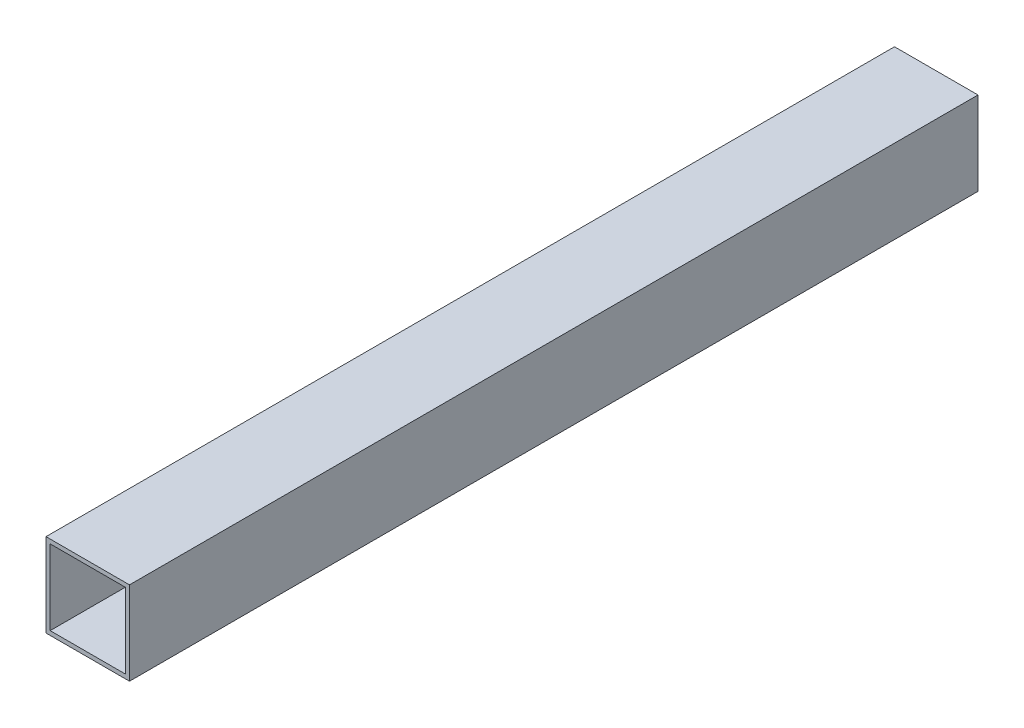
ISO-10303-21;
HEADER;
FILE_DESCRIPTION(('STEP AP214'),'2;1');
FILE_NAME('part.step','',(''),(''),'','','');
FILE_SCHEMA(('AUTOMOTIVE_DESIGN { 1 0 10303 214 1 1 1 1 }'));
ENDSEC;
DATA;
#1=APPLICATION_CONTEXT('core data for automotive mechanical design processes');
#2=APPLICATION_PROTOCOL_DEFINITION('international standard','automotive_design',2000,#1);
#3=PRODUCT_CONTEXT('',#1,'mechanical');
#4=PRODUCT('Part','Part','',(#3));
#5=PRODUCT_RELATED_PRODUCT_CATEGORY('part','',(#4));
#6=PRODUCT_DEFINITION_FORMATION('','',#4);
#7=PRODUCT_DEFINITION_CONTEXT('part definition',#1,'design');
#8=PRODUCT_DEFINITION('design','',#6,#7);
#9=PRODUCT_DEFINITION_SHAPE('','',#8);
#10=(LENGTH_UNIT() NAMED_UNIT(*) SI_UNIT(.MILLI.,.METRE.));
#11=(NAMED_UNIT(*) PLANE_ANGLE_UNIT() SI_UNIT($,.RADIAN.));
#12=(NAMED_UNIT(*) SI_UNIT($,.STERADIAN.) SOLID_ANGLE_UNIT());
#13=UNCERTAINTY_MEASURE_WITH_UNIT(LENGTH_MEASURE(1.E-05),#10,'distance_accuracy_value','');
#14=(GEOMETRIC_REPRESENTATION_CONTEXT(3) GLOBAL_UNCERTAINTY_ASSIGNED_CONTEXT((#13)) GLOBAL_UNIT_ASSIGNED_CONTEXT((#10,
#11,#12)) REPRESENTATION_CONTEXT('',''));
#15=CARTESIAN_POINT('',(0.,0.,0.));
#16=DIRECTION('',(0.,0.,1.));
#17=DIRECTION('',(1.,0.,0.));
#18=AXIS2_PLACEMENT_3D('',#15,#16,#17);
#19=CARTESIAN_POINT('',(-20.,-20.,406.5));
#20=DIRECTION('',(0.,0.,1.));
#21=DIRECTION('',(1.,0.,0.));
#22=AXIS2_PLACEMENT_3D('',#19,#20,#21);
#23=PLANE('',#22);
#24=DIRECTION('',(0.,-1.,0.));
#25=VECTOR('',#24,1.);
#26=CARTESIAN_POINT('',(-20.,-20.,406.5));
#27=LINE('',#26,#25);
#28=CARTESIAN_POINT('',(-20.,20.,406.5));
#29=VERTEX_POINT('',#28);
#30=CARTESIAN_POINT('',(-20.,-20.,406.5));
#31=VERTEX_POINT('',#30);
#32=EDGE_CURVE('E155',#29,#31,#27,.T.);
#33=ORIENTED_EDGE('',*,*,#32,.T.);
#34=DIRECTION('',(1.,0.,0.));
#35=VECTOR('',#34,1.);
#36=CARTESIAN_POINT('',(20.,-20.,406.5));
#37=LINE('',#36,#35);
#38=CARTESIAN_POINT('',(20.,-20.,406.5));
#39=VERTEX_POINT('',#38);
#40=EDGE_CURVE('E158',#31,#39,#37,.T.);
#41=ORIENTED_EDGE('',*,*,#40,.T.);
#42=DIRECTION('',(0.,1.,0.));
#43=VECTOR('',#42,1.);
#44=CARTESIAN_POINT('',(20.,-20.,406.5));
#45=LINE('',#44,#43);
#46=CARTESIAN_POINT('',(20.,20.,406.5));
#47=VERTEX_POINT('',#46);
#48=EDGE_CURVE('E161',#39,#47,#45,.T.);
#49=ORIENTED_EDGE('',*,*,#48,.T.);
#50=DIRECTION('',(-1.,0.,0.));
#51=VECTOR('',#50,1.);
#52=CARTESIAN_POINT('',(20.,20.,406.5));
#53=LINE('',#52,#51);
#54=EDGE_CURVE('E163',#47,#29,#53,.T.);
#55=ORIENTED_EDGE('',*,*,#54,.T.);
#56=EDGE_LOOP('',(#33,#41,#49,#55));
#57=FACE_BOUND('',#56,.T.);
#58=DIRECTION('',(1.,0.,0.));
#59=VECTOR('',#58,1.);
#60=CARTESIAN_POINT('',(20.,-18.,406.5));
#61=LINE('',#60,#59);
#62=CARTESIAN_POINT('',(-18.,-18.,406.5));
#63=VERTEX_POINT('',#62);
#64=CARTESIAN_POINT('',(18.,-18.,406.5));
#65=VERTEX_POINT('',#64);
#66=EDGE_CURVE('E127',#63,#65,#61,.T.);
#67=ORIENTED_EDGE('',*,*,#66,.F.);
#68=DIRECTION('',(0.,-1.,0.));
#69=VECTOR('',#68,1.);
#70=CARTESIAN_POINT('',(-18.,-20.,406.5));
#71=LINE('',#70,#69);
#72=CARTESIAN_POINT('',(-18.,18.,406.5));
#73=VERTEX_POINT('',#72);
#74=EDGE_CURVE('E119',#73,#63,#71,.T.);
#75=ORIENTED_EDGE('',*,*,#74,.F.);
#76=DIRECTION('',(-1.,0.,0.));
#77=VECTOR('',#76,1.);
#78=CARTESIAN_POINT('',(20.,18.,406.5));
#79=LINE('',#78,#77);
#80=CARTESIAN_POINT('',(18.,18.,406.5));
#81=VERTEX_POINT('',#80);
#82=EDGE_CURVE('E141',#81,#73,#79,.T.);
#83=ORIENTED_EDGE('',*,*,#82,.F.);
#84=DIRECTION('',(0.,1.,0.));
#85=VECTOR('',#84,1.);
#86=CARTESIAN_POINT('',(18.,-20.,406.5));
#87=LINE('',#86,#85);
#88=EDGE_CURVE('E139',#65,#81,#87,.T.);
#89=ORIENTED_EDGE('',*,*,#88,.F.);
#90=EDGE_LOOP('',(#67,#75,#83,#89));
#91=FACE_BOUND('',#90,.T.);
#92=ADVANCED_FACE('F54',(#57,#91),#23,.T.);
#93=CARTESIAN_POINT('',(-20.,-20.,0.));
#94=DIRECTION('',(0.,0.,1.));
#95=DIRECTION('',(1.,0.,0.));
#96=AXIS2_PLACEMENT_3D('',#93,#94,#95);
#97=PLANE('',#96);
#98=DIRECTION('',(0.,-1.,0.));
#99=VECTOR('',#98,1.);
#100=CARTESIAN_POINT('',(-20.,-20.,0.));
#101=LINE('',#100,#99);
#102=CARTESIAN_POINT('',(-20.,20.,0.));
#103=VERTEX_POINT('',#102);
#104=CARTESIAN_POINT('',(-20.,-20.,0.));
#105=VERTEX_POINT('',#104);
#106=EDGE_CURVE('E135',#103,#105,#101,.T.);
#107=ORIENTED_EDGE('',*,*,#106,.F.);
#108=DIRECTION('',(-1.,0.,0.));
#109=VECTOR('',#108,1.);
#110=CARTESIAN_POINT('',(20.,20.,0.));
#111=LINE('',#110,#109);
#112=CARTESIAN_POINT('',(20.,20.,0.));
#113=VERTEX_POINT('',#112);
#114=EDGE_CURVE('E159',#113,#103,#111,.T.);
#115=ORIENTED_EDGE('',*,*,#114,.F.);
#116=DIRECTION('',(0.,1.,0.));
#117=VECTOR('',#116,1.);
#118=CARTESIAN_POINT('',(20.,-20.,0.));
#119=LINE('',#118,#117);
#120=CARTESIAN_POINT('',(20.,-20.,0.));
#121=VERTEX_POINT('',#120);
#122=EDGE_CURVE('E170',#121,#113,#119,.T.);
#123=ORIENTED_EDGE('',*,*,#122,.F.);
#124=DIRECTION('',(1.,0.,0.));
#125=VECTOR('',#124,1.);
#126=CARTESIAN_POINT('',(20.,-20.,0.));
#127=LINE('',#126,#125);
#128=EDGE_CURVE('E168',#105,#121,#127,.T.);
#129=ORIENTED_EDGE('',*,*,#128,.F.);
#130=EDGE_LOOP('',(#107,#115,#123,#129));
#131=FACE_BOUND('',#130,.T.);
#132=DIRECTION('',(0.,-1.,0.));
#133=VECTOR('',#132,1.);
#134=CARTESIAN_POINT('',(-18.,-20.,0.));
#135=LINE('',#134,#133);
#136=CARTESIAN_POINT('',(-18.,18.,0.));
#137=VERTEX_POINT('',#136);
#138=CARTESIAN_POINT('',(-18.,-18.,0.));
#139=VERTEX_POINT('',#138);
#140=EDGE_CURVE('E77',#137,#139,#135,.T.);
#141=ORIENTED_EDGE('',*,*,#140,.T.);
#142=DIRECTION('',(1.,0.,0.));
#143=VECTOR('',#142,1.);
#144=CARTESIAN_POINT('',(20.,-18.,0.));
#145=LINE('',#144,#143);
#146=CARTESIAN_POINT('',(18.,-18.,0.));
#147=VERTEX_POINT('',#146);
#148=EDGE_CURVE('E134',#139,#147,#145,.T.);
#149=ORIENTED_EDGE('',*,*,#148,.T.);
#150=DIRECTION('',(0.,1.,0.));
#151=VECTOR('',#150,1.);
#152=CARTESIAN_POINT('',(18.,-20.,0.));
#153=LINE('',#152,#151);
#154=CARTESIAN_POINT('',(18.,18.,0.));
#155=VERTEX_POINT('',#154);
#156=EDGE_CURVE('E147',#147,#155,#153,.T.);
#157=ORIENTED_EDGE('',*,*,#156,.T.);
#158=DIRECTION('',(-1.,0.,0.));
#159=VECTOR('',#158,1.);
#160=CARTESIAN_POINT('',(20.,18.,0.));
#161=LINE('',#160,#159);
#162=EDGE_CURVE('E128',#155,#137,#161,.T.);
#163=ORIENTED_EDGE('',*,*,#162,.T.);
#164=EDGE_LOOP('',(#141,#149,#157,#163));
#165=FACE_BOUND('',#164,.T.);
#166=ADVANCED_FACE('F188',(#131,#165),#97,.F.);
#167=CARTESIAN_POINT('',(-20.,-20.,406.5));
#168=DIRECTION('',(1.,0.,0.));
#169=DIRECTION('',(0.,0.,-1.));
#170=AXIS2_PLACEMENT_3D('',#167,#168,#169);
#171=PLANE('',#170);
#172=ORIENTED_EDGE('',*,*,#106,.T.);
#173=DIRECTION('',(0.,0.,-1.));
#174=VECTOR('',#173,1.);
#175=CARTESIAN_POINT('',(-20.,-20.,406.5));
#176=LINE('',#175,#174);
#177=EDGE_CURVE('E12',#31,#105,#176,.T.);
#178=ORIENTED_EDGE('',*,*,#177,.F.);
#179=ORIENTED_EDGE('',*,*,#32,.F.);
#180=DIRECTION('',(0.,0.,-1.));
#181=VECTOR('',#180,1.);
#182=CARTESIAN_POINT('',(-20.,20.,406.5));
#183=LINE('',#182,#181);
#184=EDGE_CURVE('E165',#29,#103,#183,.T.);
#185=ORIENTED_EDGE('',*,*,#184,.T.);
#186=EDGE_LOOP('',(#172,#178,#179,#185));
#187=FACE_BOUND('',#186,.T.);
#188=ADVANCED_FACE('F56',(#187),#171,.F.);
#189=CARTESIAN_POINT('',(20.,-20.,406.5));
#190=DIRECTION('',(0.,1.,0.));
#191=DIRECTION('',(-1.,0.,0.));
#192=AXIS2_PLACEMENT_3D('',#189,#190,#191);
#193=PLANE('',#192);
#194=ORIENTED_EDGE('',*,*,#128,.T.);
#195=DIRECTION('',(0.,0.,-1.));
#196=VECTOR('',#195,1.);
#197=CARTESIAN_POINT('',(20.,-20.,406.5));
#198=LINE('',#197,#196);
#199=EDGE_CURVE('E62',#39,#121,#198,.T.);
#200=ORIENTED_EDGE('',*,*,#199,.F.);
#201=ORIENTED_EDGE('',*,*,#40,.F.);
#202=ORIENTED_EDGE('',*,*,#177,.T.);
#203=EDGE_LOOP('',(#194,#200,#201,#202));
#204=FACE_BOUND('',#203,.T.);
#205=ADVANCED_FACE('F198',(#204),#193,.F.);
#206=CARTESIAN_POINT('',(20.,-20.,406.5));
#207=DIRECTION('',(-1.,0.,0.));
#208=DIRECTION('',(0.,0.,1.));
#209=AXIS2_PLACEMENT_3D('',#206,#207,#208);
#210=PLANE('',#209);
#211=ORIENTED_EDGE('',*,*,#122,.T.);
#212=DIRECTION('',(0.,0.,-1.));
#213=VECTOR('',#212,1.);
#214=CARTESIAN_POINT('',(20.,20.,406.5));
#215=LINE('',#214,#213);
#216=EDGE_CURVE('E175',#47,#113,#215,.T.);
#217=ORIENTED_EDGE('',*,*,#216,.F.);
#218=ORIENTED_EDGE('',*,*,#48,.F.);
#219=ORIENTED_EDGE('',*,*,#199,.T.);
#220=EDGE_LOOP('',(#211,#217,#218,#219));
#221=FACE_BOUND('',#220,.T.);
#222=ADVANCED_FACE('F182',(#221),#210,.F.);
#223=CARTESIAN_POINT('',(20.,20.,406.5));
#224=DIRECTION('',(0.,-1.,0.));
#225=DIRECTION('',(1.,0.,0.));
#226=AXIS2_PLACEMENT_3D('',#223,#224,#225);
#227=PLANE('',#226);
#228=ORIENTED_EDGE('',*,*,#114,.T.);
#229=ORIENTED_EDGE('',*,*,#184,.F.);
#230=ORIENTED_EDGE('',*,*,#54,.F.);
#231=ORIENTED_EDGE('',*,*,#216,.T.);
#232=EDGE_LOOP('',(#228,#229,#230,#231));
#233=FACE_BOUND('',#232,.T.);
#234=ADVANCED_FACE('F192',(#233),#227,.F.);
#235=CARTESIAN_POINT('',(-18.,-20.,406.5));
#236=DIRECTION('',(1.,0.,0.));
#237=DIRECTION('',(0.,0.,-1.));
#238=AXIS2_PLACEMENT_3D('',#235,#236,#237);
#239=PLANE('',#238);
#240=ORIENTED_EDGE('',*,*,#140,.F.);
#241=DIRECTION('',(0.,0.,-1.));
#242=VECTOR('',#241,1.);
#243=CARTESIAN_POINT('',(-18.,18.,406.5));
#244=LINE('',#243,#242);
#245=EDGE_CURVE('E123',#73,#137,#244,.T.);
#246=ORIENTED_EDGE('',*,*,#245,.F.);
#247=ORIENTED_EDGE('',*,*,#74,.T.);
#248=DIRECTION('',(0.,0.,-1.));
#249=VECTOR('',#248,1.);
#250=CARTESIAN_POINT('',(-18.,-18.,406.5));
#251=LINE('',#250,#249);
#252=EDGE_CURVE('E122',#63,#139,#251,.T.);
#253=ORIENTED_EDGE('',*,*,#252,.T.);
#254=EDGE_LOOP('',(#240,#246,#247,#253));
#255=FACE_BOUND('',#254,.T.);
#256=ADVANCED_FACE('F121',(#255),#239,.T.);
#257=CARTESIAN_POINT('',(20.,-18.,406.5));
#258=DIRECTION('',(0.,1.,0.));
#259=DIRECTION('',(-1.,0.,0.));
#260=AXIS2_PLACEMENT_3D('',#257,#258,#259);
#261=PLANE('',#260);
#262=ORIENTED_EDGE('',*,*,#148,.F.);
#263=ORIENTED_EDGE('',*,*,#252,.F.);
#264=ORIENTED_EDGE('',*,*,#66,.T.);
#265=DIRECTION('',(0.,0.,-1.));
#266=VECTOR('',#265,1.);
#267=CARTESIAN_POINT('',(18.,-18.,406.5));
#268=LINE('',#267,#266);
#269=EDGE_CURVE('E136',#65,#147,#268,.T.);
#270=ORIENTED_EDGE('',*,*,#269,.T.);
#271=EDGE_LOOP('',(#262,#263,#264,#270));
#272=FACE_BOUND('',#271,.T.);
#273=ADVANCED_FACE('F131',(#272),#261,.T.);
#274=CARTESIAN_POINT('',(18.,-20.,406.5));
#275=DIRECTION('',(-1.,0.,0.));
#276=DIRECTION('',(0.,0.,1.));
#277=AXIS2_PLACEMENT_3D('',#274,#275,#276);
#278=PLANE('',#277);
#279=ORIENTED_EDGE('',*,*,#156,.F.);
#280=ORIENTED_EDGE('',*,*,#269,.F.);
#281=ORIENTED_EDGE('',*,*,#88,.T.);
#282=DIRECTION('',(0.,0.,-1.));
#283=VECTOR('',#282,1.);
#284=CARTESIAN_POINT('',(18.,18.,406.5));
#285=LINE('',#284,#283);
#286=EDGE_CURVE('E69',#81,#155,#285,.T.);
#287=ORIENTED_EDGE('',*,*,#286,.T.);
#288=EDGE_LOOP('',(#279,#280,#281,#287));
#289=FACE_BOUND('',#288,.T.);
#290=ADVANCED_FACE('F221',(#289),#278,.T.);
#291=CARTESIAN_POINT('',(20.,18.,406.5));
#292=DIRECTION('',(0.,-1.,0.));
#293=DIRECTION('',(1.,0.,0.));
#294=AXIS2_PLACEMENT_3D('',#291,#292,#293);
#295=PLANE('',#294);
#296=ORIENTED_EDGE('',*,*,#162,.F.);
#297=ORIENTED_EDGE('',*,*,#286,.F.);
#298=ORIENTED_EDGE('',*,*,#82,.T.);
#299=ORIENTED_EDGE('',*,*,#245,.T.);
#300=EDGE_LOOP('',(#296,#297,#298,#299));
#301=FACE_BOUND('',#300,.T.);
#302=ADVANCED_FACE('F225',(#301),#295,.T.);
#303=CLOSED_SHELL('',(#92,#166,#188,#205,#222,#234,#256,#273,#290,#302));
#304=MANIFOLD_SOLID_BREP('B2',#303);
#305=ADVANCED_BREP_SHAPE_REPRESENTATION('',(#18,#304),#14);
#306=SHAPE_DEFINITION_REPRESENTATION(#9,#305);
ENDSEC;
END-ISO-10303-21;
